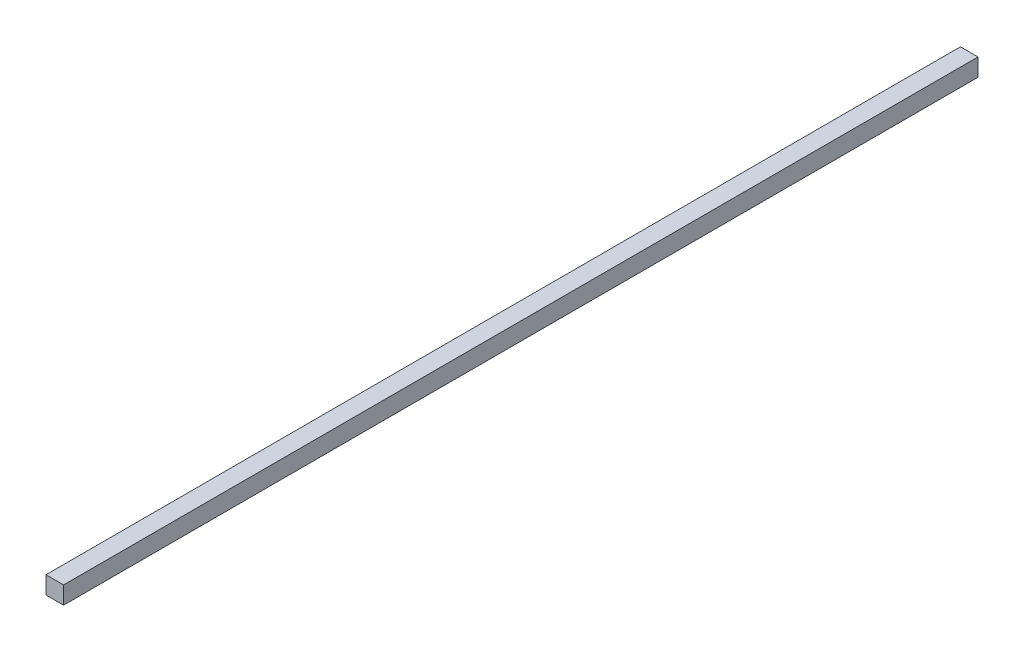
ISO-10303-21;
HEADER;
FILE_DESCRIPTION(('STEP AP214'),'2;1');
FILE_NAME('part.step','',(''),(''),'','','');
FILE_SCHEMA(('AUTOMOTIVE_DESIGN { 1 0 10303 214 1 1 1 1 }'));
ENDSEC;
DATA;
#1=APPLICATION_CONTEXT('core data for automotive mechanical design processes');
#2=APPLICATION_PROTOCOL_DEFINITION('international standard','automotive_design',2000,#1);
#3=PRODUCT_CONTEXT('',#1,'mechanical');
#4=PRODUCT('Part','Part','',(#3));
#5=PRODUCT_RELATED_PRODUCT_CATEGORY('part','',(#4));
#6=PRODUCT_DEFINITION_FORMATION('','',#4);
#7=PRODUCT_DEFINITION_CONTEXT('part definition',#1,'design');
#8=PRODUCT_DEFINITION('design','',#6,#7);
#9=PRODUCT_DEFINITION_SHAPE('','',#8);
#10=(LENGTH_UNIT() NAMED_UNIT(*) SI_UNIT(.MILLI.,.METRE.));
#11=(NAMED_UNIT(*) PLANE_ANGLE_UNIT() SI_UNIT($,.RADIAN.));
#12=(NAMED_UNIT(*) SI_UNIT($,.STERADIAN.) SOLID_ANGLE_UNIT());
#13=UNCERTAINTY_MEASURE_WITH_UNIT(LENGTH_MEASURE(1.E-05),#10,'distance_accuracy_value','');
#14=(GEOMETRIC_REPRESENTATION_CONTEXT(3) GLOBAL_UNCERTAINTY_ASSIGNED_CONTEXT((#13)) GLOBAL_UNIT_ASSIGNED_CONTEXT((#10,
#11,#12)) REPRESENTATION_CONTEXT('',''));
#15=CARTESIAN_POINT('',(0.,0.,0.));
#16=DIRECTION('',(0.,0.,1.));
#17=DIRECTION('',(1.,0.,0.));
#18=AXIS2_PLACEMENT_3D('',#15,#16,#17);
#19=CARTESIAN_POINT('',(0.,6.35,0.));
#20=DIRECTION('',(1.,0.,0.));
#21=DIRECTION('',(0.,0.,-1.));
#22=AXIS2_PLACEMENT_3D('',#19,#20,#21);
#23=PLANE('',#22);
#24=DIRECTION('',(0.,0.,1.));
#25=VECTOR('',#24,1.);
#26=CARTESIAN_POINT('',(0.,0.,0.));
#27=LINE('',#26,#25);
#28=CARTESIAN_POINT('',(0.,0.,-330.2));
#29=VERTEX_POINT('',#28);
#30=CARTESIAN_POINT('',(0.,0.,0.));
#31=VERTEX_POINT('',#30);
#32=EDGE_CURVE('E105',#29,#31,#27,.T.);
#33=ORIENTED_EDGE('',*,*,#32,.T.);
#34=DIRECTION('',(0.,-1.,0.));
#35=VECTOR('',#34,1.);
#36=CARTESIAN_POINT('',(0.,6.35,0.));
#37=LINE('',#36,#35);
#38=CARTESIAN_POINT('',(0.,6.35,0.));
#39=VERTEX_POINT('',#38);
#40=EDGE_CURVE('E11',#39,#31,#37,.T.);
#41=ORIENTED_EDGE('',*,*,#40,.F.);
#42=DIRECTION('',(0.,0.,1.));
#43=VECTOR('',#42,1.);
#44=CARTESIAN_POINT('',(0.,6.35,0.));
#45=LINE('',#44,#43);
#46=CARTESIAN_POINT('',(0.,6.35,-330.2));
#47=VERTEX_POINT('',#46);
#48=EDGE_CURVE('E89',#47,#39,#45,.T.);
#49=ORIENTED_EDGE('',*,*,#48,.F.);
#50=DIRECTION('',(0.,-1.,0.));
#51=VECTOR('',#50,1.);
#52=CARTESIAN_POINT('',(0.,6.35,-330.2));
#53=LINE('',#52,#51);
#54=EDGE_CURVE('E98',#47,#29,#53,.T.);
#55=ORIENTED_EDGE('',*,*,#54,.T.);
#56=EDGE_LOOP('',(#33,#41,#49,#55));
#57=FACE_BOUND('',#56,.T.);
#58=ADVANCED_FACE('F39',(#57),#23,.F.);
#59=CARTESIAN_POINT('',(0.,6.35,0.));
#60=DIRECTION('',(0.,0.,-1.));
#61=DIRECTION('',(-1.,0.,0.));
#62=AXIS2_PLACEMENT_3D('',#59,#60,#61);
#63=PLANE('',#62);
#64=DIRECTION('',(1.,0.,0.));
#65=VECTOR('',#64,1.);
#66=CARTESIAN_POINT('',(0.,0.,0.));
#67=LINE('',#66,#65);
#68=CARTESIAN_POINT('',(6.35,0.,0.));
#69=VERTEX_POINT('',#68);
#70=EDGE_CURVE('E94',#31,#69,#67,.T.);
#71=ORIENTED_EDGE('',*,*,#70,.T.);
#72=DIRECTION('',(0.,-1.,0.));
#73=VECTOR('',#72,1.);
#74=CARTESIAN_POINT('',(6.35,6.35,0.));
#75=LINE('',#74,#73);
#76=CARTESIAN_POINT('',(6.35,6.35,0.));
#77=VERTEX_POINT('',#76);
#78=EDGE_CURVE('E50',#77,#69,#75,.T.);
#79=ORIENTED_EDGE('',*,*,#78,.F.);
#80=DIRECTION('',(1.,0.,0.));
#81=VECTOR('',#80,1.);
#82=CARTESIAN_POINT('',(0.,6.35,0.));
#83=LINE('',#82,#81);
#84=EDGE_CURVE('E83',#39,#77,#83,.T.);
#85=ORIENTED_EDGE('',*,*,#84,.F.);
#86=ORIENTED_EDGE('',*,*,#40,.T.);
#87=EDGE_LOOP('',(#71,#79,#85,#86));
#88=FACE_BOUND('',#87,.T.);
#89=ADVANCED_FACE('F91',(#88),#63,.F.);
#90=CARTESIAN_POINT('',(6.35,6.35,0.));
#91=DIRECTION('',(-1.,0.,0.));
#92=DIRECTION('',(0.,0.,1.));
#93=AXIS2_PLACEMENT_3D('',#90,#91,#92);
#94=PLANE('',#93);
#95=DIRECTION('',(0.,0.,-1.));
#96=VECTOR('',#95,1.);
#97=CARTESIAN_POINT('',(6.35,0.,0.));
#98=LINE('',#97,#96);
#99=CARTESIAN_POINT('',(6.35,0.,-330.2));
#100=VERTEX_POINT('',#99);
#101=EDGE_CURVE('E75',#69,#100,#98,.T.);
#102=ORIENTED_EDGE('',*,*,#101,.T.);
#103=DIRECTION('',(0.,-1.,0.));
#104=VECTOR('',#103,1.);
#105=CARTESIAN_POINT('',(6.35,6.35,-330.2));
#106=LINE('',#105,#104);
#107=CARTESIAN_POINT('',(6.35,6.35,-330.2));
#108=VERTEX_POINT('',#107);
#109=EDGE_CURVE('E92',#108,#100,#106,.T.);
#110=ORIENTED_EDGE('',*,*,#109,.F.);
#111=DIRECTION('',(0.,0.,-1.));
#112=VECTOR('',#111,1.);
#113=CARTESIAN_POINT('',(6.35,6.35,0.));
#114=LINE('',#113,#112);
#115=EDGE_CURVE('E86',#77,#108,#114,.T.);
#116=ORIENTED_EDGE('',*,*,#115,.F.);
#117=ORIENTED_EDGE('',*,*,#78,.T.);
#118=EDGE_LOOP('',(#102,#110,#116,#117));
#119=FACE_BOUND('',#118,.T.);
#120=ADVANCED_FACE('F96',(#119),#94,.F.);
#121=CARTESIAN_POINT('',(0.,6.35,-330.2));
#122=DIRECTION('',(0.,0.,1.));
#123=DIRECTION('',(1.,0.,0.));
#124=AXIS2_PLACEMENT_3D('',#121,#122,#123);
#125=PLANE('',#124);
#126=DIRECTION('',(-1.,0.,0.));
#127=VECTOR('',#126,1.);
#128=CARTESIAN_POINT('',(0.,0.,-330.2));
#129=LINE('',#128,#127);
#130=EDGE_CURVE('E79',#100,#29,#129,.T.);
#131=ORIENTED_EDGE('',*,*,#130,.T.);
#132=ORIENTED_EDGE('',*,*,#54,.F.);
#133=DIRECTION('',(-1.,0.,0.));
#134=VECTOR('',#133,1.);
#135=CARTESIAN_POINT('',(0.,6.35,-330.2));
#136=LINE('',#135,#134);
#137=EDGE_CURVE('E54',#108,#47,#136,.T.);
#138=ORIENTED_EDGE('',*,*,#137,.F.);
#139=ORIENTED_EDGE('',*,*,#109,.T.);
#140=EDGE_LOOP('',(#131,#132,#138,#139));
#141=FACE_BOUND('',#140,.T.);
#142=ADVANCED_FACE('F108',(#141),#125,.F.);
#143=CARTESIAN_POINT('',(0.,6.35,0.));
#144=DIRECTION('',(0.,-1.,0.));
#145=DIRECTION('',(0.,0.,-1.));
#146=AXIS2_PLACEMENT_3D('',#143,#144,#145);
#147=PLANE('',#146);
#148=ORIENTED_EDGE('',*,*,#48,.T.);
#149=ORIENTED_EDGE('',*,*,#84,.T.);
#150=ORIENTED_EDGE('',*,*,#115,.T.);
#151=ORIENTED_EDGE('',*,*,#137,.T.);
#152=EDGE_LOOP('',(#148,#149,#150,#151));
#153=FACE_BOUND('',#152,.T.);
#154=ADVANCED_FACE('F88',(#153),#147,.F.);
#155=CARTESIAN_POINT('',(0.,0.,0.));
#156=DIRECTION('',(0.,-1.,0.));
#157=DIRECTION('',(0.,0.,-1.));
#158=AXIS2_PLACEMENT_3D('',#155,#156,#157);
#159=PLANE('',#158);
#160=ORIENTED_EDGE('',*,*,#32,.F.);
#161=ORIENTED_EDGE('',*,*,#130,.F.);
#162=ORIENTED_EDGE('',*,*,#101,.F.);
#163=ORIENTED_EDGE('',*,*,#70,.F.);
#164=EDGE_LOOP('',(#160,#161,#162,#163));
#165=FACE_BOUND('',#164,.T.);
#166=ADVANCED_FACE('F115',(#165),#159,.T.);
#167=CLOSED_SHELL('',(#58,#89,#120,#142,#154,#166));
#168=MANIFOLD_SOLID_BREP('B2',#167);
#169=ADVANCED_BREP_SHAPE_REPRESENTATION('',(#18,#168),#14);
#170=SHAPE_DEFINITION_REPRESENTATION(#9,#169);
ENDSEC;
END-ISO-10303-21;
